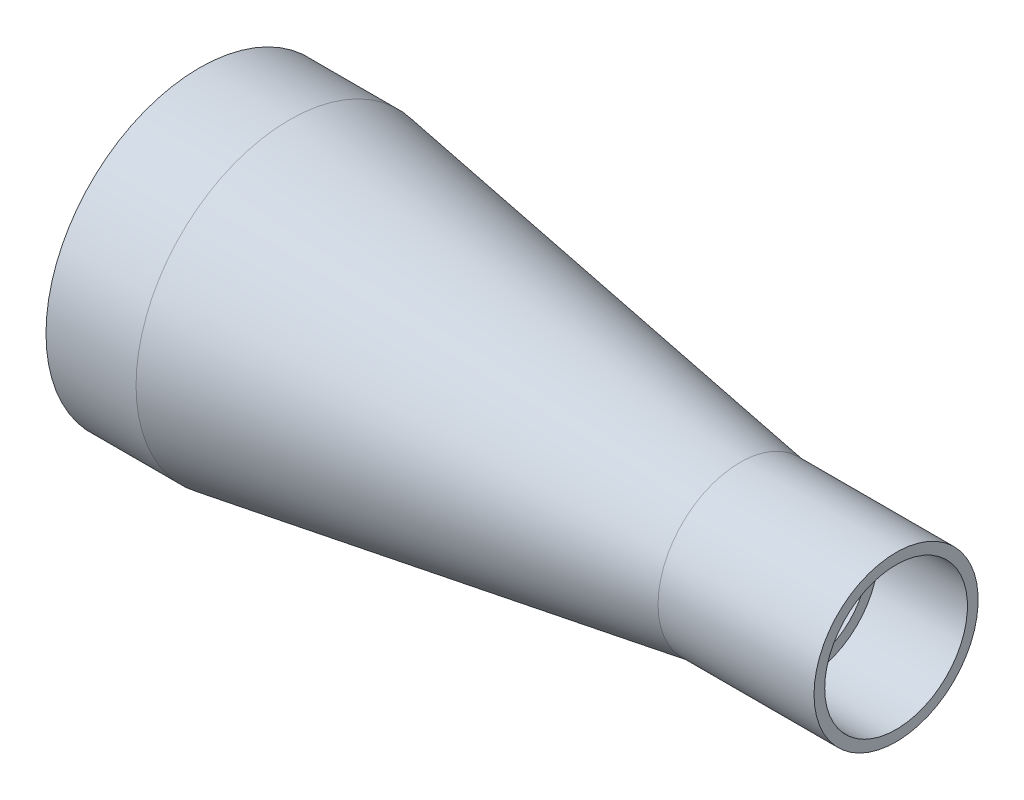
ISO-10303-21;
HEADER;
FILE_DESCRIPTION(('STEP AP214'),'2;1');
FILE_NAME('part.step','',(''),(''),'','','');
FILE_SCHEMA(('AUTOMOTIVE_DESIGN { 1 0 10303 214 1 1 1 1 }'));
ENDSEC;
DATA;
#1=APPLICATION_CONTEXT('core data for automotive mechanical design processes');
#2=APPLICATION_PROTOCOL_DEFINITION('international standard','automotive_design',2000,#1);
#3=PRODUCT_CONTEXT('',#1,'mechanical');
#4=PRODUCT('Part','Part','',(#3));
#5=PRODUCT_RELATED_PRODUCT_CATEGORY('part','',(#4));
#6=PRODUCT_DEFINITION_FORMATION('','',#4);
#7=PRODUCT_DEFINITION_CONTEXT('part definition',#1,'design');
#8=PRODUCT_DEFINITION('design','',#6,#7);
#9=PRODUCT_DEFINITION_SHAPE('','',#8);
#10=(LENGTH_UNIT() NAMED_UNIT(*) SI_UNIT(.MILLI.,.METRE.));
#11=(NAMED_UNIT(*) PLANE_ANGLE_UNIT() SI_UNIT($,.RADIAN.));
#12=(NAMED_UNIT(*) SI_UNIT($,.STERADIAN.) SOLID_ANGLE_UNIT());
#13=UNCERTAINTY_MEASURE_WITH_UNIT(LENGTH_MEASURE(1.E-05),#10,'distance_accuracy_value','');
#14=(GEOMETRIC_REPRESENTATION_CONTEXT(3) GLOBAL_UNCERTAINTY_ASSIGNED_CONTEXT((#13)) GLOBAL_UNIT_ASSIGNED_CONTEXT((#10,
#11,#12)) REPRESENTATION_CONTEXT('',''));
#15=CARTESIAN_POINT('',(0.,0.,0.));
#16=DIRECTION('',(0.,0.,1.));
#17=DIRECTION('',(1.,0.,0.));
#18=AXIS2_PLACEMENT_3D('',#15,#16,#17);
#19=CARTESIAN_POINT('',(0.,0.,-14.8));
#20=DIRECTION('',(1.,0.,0.));
#21=DIRECTION('',(0.,0.,-1.));
#22=AXIS2_PLACEMENT_3D('',#19,#20,#21);
#23=PLANE('',#22);
#24=CARTESIAN_POINT('',(0.,0.,0.));
#25=DIRECTION('',(-1.,0.,0.));
#26=DIRECTION('',(0.,0.,1.));
#27=AXIS2_PLACEMENT_3D('',#24,#25,#26);
#28=CIRCLE('',#27,14.8);
#29=CARTESIAN_POINT('',(0.,0.,14.8));
#30=VERTEX_POINT('',#29);
#31=EDGE_CURVE('E12',#30,#30,#28,.T.);
#32=ORIENTED_EDGE('',*,*,#31,.F.);
#33=EDGE_LOOP('',(#32));
#34=FACE_BOUND('',#33,.T.);
#35=CARTESIAN_POINT('',(0.,0.,0.));
#36=DIRECTION('',(-1.,0.,0.));
#37=DIRECTION('',(0.,0.,1.));
#38=AXIS2_PLACEMENT_3D('',#35,#36,#37);
#39=CIRCLE('',#38,16.);
#40=CARTESIAN_POINT('',(0.,0.,16.));
#41=VERTEX_POINT('',#40);
#42=EDGE_CURVE('E79',#41,#41,#39,.T.);
#43=ORIENTED_EDGE('',*,*,#42,.T.);
#44=EDGE_LOOP('',(#43));
#45=FACE_BOUND('',#44,.T.);
#46=ADVANCED_FACE('F42',(#34,#45),#23,.F.);
#47=CARTESIAN_POINT('',(-12.4462365591398,0.,0.));
#48=DIRECTION('',(-1.,0.,0.));
#49=DIRECTION('',(0.,0.,1.));
#50=AXIS2_PLACEMENT_3D('',#47,#48,#49);
#51=CYLINDRICAL_SURFACE('',#50,14.8);
#52=CARTESIAN_POINT('',(7.57650181761039,0.,0.));
#53=DIRECTION('',(-1.,0.,0.));
#54=DIRECTION('',(0.,0.,1.));
#55=AXIS2_PLACEMENT_3D('',#52,#53,#54);
#56=CIRCLE('',#55,14.8);
#57=CARTESIAN_POINT('',(7.57650181761039,0.,14.8));
#58=VERTEX_POINT('',#57);
#59=EDGE_CURVE('E48',#58,#58,#56,.T.);
#60=ORIENTED_EDGE('',*,*,#59,.F.);
#61=EDGE_LOOP('',(#60));
#62=FACE_BOUND('',#61,.T.);
#63=ORIENTED_EDGE('',*,*,#31,.T.);
#64=EDGE_LOOP('',(#63));
#65=FACE_BOUND('',#64,.T.);
#66=ADVANCED_FACE('F134',(#62,#65),#51,.F.);
#67=CARTESIAN_POINT('',(50.5100121174026,0.,0.));
#68=DIRECTION('',(-1.,0.,0.));
#69=DIRECTION('',(0.,0.,1.));
#70=AXIS2_PLACEMENT_3D('',#67,#68,#69);
#71=CONICAL_SURFACE('',#70,8.,0.157079632679483);
#72=CARTESIAN_POINT('',(58.086513935013,0.,0.));
#73=DIRECTION('',(-1.,0.,0.));
#74=DIRECTION('',(0.,0.,1.));
#75=AXIS2_PLACEMENT_3D('',#72,#73,#74);
#76=CIRCLE('',#75,6.8);
#77=CARTESIAN_POINT('',(58.086513935013,0.,6.8));
#78=VERTEX_POINT('',#77);
#79=EDGE_CURVE('E52',#78,#78,#76,.T.);
#80=ORIENTED_EDGE('',*,*,#79,.F.);
#81=EDGE_LOOP('',(#80));
#82=FACE_BOUND('',#81,.T.);
#83=ORIENTED_EDGE('',*,*,#59,.T.);
#84=EDGE_LOOP('',(#83));
#85=FACE_BOUND('',#84,.T.);
#86=ADVANCED_FACE('F129',(#82,#85),#71,.F.);
#87=CARTESIAN_POINT('',(58.086513935013,0.,-6.8));
#88=DIRECTION('',(-1.,0.,0.));
#89=DIRECTION('',(0.,0.,1.));
#90=AXIS2_PLACEMENT_3D('',#87,#88,#89);
#91=PLANE('',#90);
#92=CARTESIAN_POINT('',(58.086513935013,0.,0.));
#93=DIRECTION('',(-1.,0.,0.));
#94=DIRECTION('',(0.,0.,1.));
#95=AXIS2_PLACEMENT_3D('',#92,#93,#94);
#96=CIRCLE('',#95,8.);
#97=CARTESIAN_POINT('',(58.086513935013,0.,8.));
#98=VERTEX_POINT('',#97);
#99=EDGE_CURVE('E56',#98,#98,#96,.T.);
#100=ORIENTED_EDGE('',*,*,#99,.F.);
#101=EDGE_LOOP('',(#100));
#102=FACE_BOUND('',#101,.T.);
#103=ORIENTED_EDGE('',*,*,#79,.T.);
#104=EDGE_LOOP('',(#103));
#105=FACE_BOUND('',#104,.T.);
#106=ADVANCED_FACE('F123',(#102,#105),#91,.F.);
#107=CARTESIAN_POINT('',(-12.4462365591398,0.,0.));
#108=DIRECTION('',(-1.,0.,0.));
#109=DIRECTION('',(0.,0.,1.));
#110=AXIS2_PLACEMENT_3D('',#107,#108,#109);
#111=CYLINDRICAL_SURFACE('',#110,8.);
#112=CARTESIAN_POINT('',(68.086513935013,0.,0.));
#113=DIRECTION('',(-1.,0.,0.));
#114=DIRECTION('',(0.,0.,1.));
#115=AXIS2_PLACEMENT_3D('',#112,#113,#114);
#116=CIRCLE('',#115,8.);
#117=CARTESIAN_POINT('',(68.086513935013,0.,8.));
#118=VERTEX_POINT('',#117);
#119=EDGE_CURVE('E61',#118,#118,#116,.T.);
#120=ORIENTED_EDGE('',*,*,#119,.F.);
#121=EDGE_LOOP('',(#120));
#122=FACE_BOUND('',#121,.T.);
#123=ORIENTED_EDGE('',*,*,#99,.T.);
#124=EDGE_LOOP('',(#123));
#125=FACE_BOUND('',#124,.T.);
#126=ADVANCED_FACE('F117',(#122,#125),#111,.F.);
#127=CARTESIAN_POINT('',(68.086513935013,0.,-8.));
#128=DIRECTION('',(-1.,0.,0.));
#129=DIRECTION('',(0.,0.,1.));
#130=AXIS2_PLACEMENT_3D('',#127,#128,#129);
#131=PLANE('',#130);
#132=CARTESIAN_POINT('',(68.086513935013,0.,0.));
#133=DIRECTION('',(-1.,0.,0.));
#134=DIRECTION('',(0.,0.,1.));
#135=AXIS2_PLACEMENT_3D('',#132,#133,#134);
#136=CIRCLE('',#135,9.2);
#137=CARTESIAN_POINT('',(68.086513935013,0.,9.2));
#138=VERTEX_POINT('',#137);
#139=EDGE_CURVE('E64',#138,#138,#136,.T.);
#140=ORIENTED_EDGE('',*,*,#139,.F.);
#141=EDGE_LOOP('',(#140));
#142=FACE_BOUND('',#141,.T.);
#143=ORIENTED_EDGE('',*,*,#119,.T.);
#144=EDGE_LOOP('',(#143));
#145=FACE_BOUND('',#144,.T.);
#146=ADVANCED_FACE('F111',(#142,#145),#131,.F.);
#147=CARTESIAN_POINT('',(-12.4462365591398,0.,0.));
#148=DIRECTION('',(-1.,0.,0.));
#149=DIRECTION('',(0.,0.,1.));
#150=AXIS2_PLACEMENT_3D('',#147,#148,#149);
#151=CYLINDRICAL_SURFACE('',#150,9.2);
#152=CARTESIAN_POINT('',(50.6044541655921,0.,0.));
#153=DIRECTION('',(-1.,0.,0.));
#154=DIRECTION('',(0.,0.,1.));
#155=AXIS2_PLACEMENT_3D('',#152,#153,#154);
#156=CIRCLE('',#155,9.2);
#157=CARTESIAN_POINT('',(50.6044541655921,0.,9.2));
#158=VERTEX_POINT('',#157);
#159=EDGE_CURVE('E67',#158,#158,#156,.T.);
#160=ORIENTED_EDGE('',*,*,#159,.F.);
#161=EDGE_LOOP('',(#160));
#162=FACE_BOUND('',#161,.T.);
#163=ORIENTED_EDGE('',*,*,#139,.T.);
#164=EDGE_LOOP('',(#163));
#165=FACE_BOUND('',#164,.T.);
#166=ADVANCED_FACE('F105',(#162,#165),#151,.T.);
#167=CARTESIAN_POINT('',(50.6044541655921,0.,0.));
#168=DIRECTION('',(-1.,0.,0.));
#169=DIRECTION('',(0.,0.,1.));
#170=AXIS2_PLACEMENT_3D('',#167,#168,#169);
#171=CONICAL_SURFACE('',#170,9.2,0.157079632679483);
#172=CARTESIAN_POINT('',(0.0944420481895289,0.,0.));
#173=DIRECTION('',(-1.,0.,0.));
#174=DIRECTION('',(0.,0.,1.));
#175=AXIS2_PLACEMENT_3D('',#172,#173,#174);
#176=CIRCLE('',#175,17.2);
#177=CARTESIAN_POINT('',(0.0944420481895289,0.,17.2));
#178=VERTEX_POINT('',#177);
#179=EDGE_CURVE('E70',#178,#178,#176,.T.);
#180=ORIENTED_EDGE('',*,*,#179,.F.);
#181=EDGE_LOOP('',(#180));
#182=FACE_BOUND('',#181,.T.);
#183=ORIENTED_EDGE('',*,*,#159,.T.);
#184=EDGE_LOOP('',(#183));
#185=FACE_BOUND('',#184,.T.);
#186=ADVANCED_FACE('F99',(#182,#185),#171,.T.);
#187=CARTESIAN_POINT('',(-12.4462365591398,0.,0.));
#188=DIRECTION('',(-1.,0.,0.));
#189=DIRECTION('',(0.,0.,1.));
#190=AXIS2_PLACEMENT_3D('',#187,#188,#189);
#191=CYLINDRICAL_SURFACE('',#190,17.2);
#192=CARTESIAN_POINT('',(-10.,0.,0.));
#193=DIRECTION('',(-1.,0.,0.));
#194=DIRECTION('',(0.,0.,1.));
#195=AXIS2_PLACEMENT_3D('',#192,#193,#194);
#196=CIRCLE('',#195,17.2);
#197=CARTESIAN_POINT('',(-10.,0.,17.2));
#198=VERTEX_POINT('',#197);
#199=EDGE_CURVE('E73',#198,#198,#196,.T.);
#200=ORIENTED_EDGE('',*,*,#199,.F.);
#201=EDGE_LOOP('',(#200));
#202=FACE_BOUND('',#201,.T.);
#203=ORIENTED_EDGE('',*,*,#179,.T.);
#204=EDGE_LOOP('',(#203));
#205=FACE_BOUND('',#204,.T.);
#206=ADVANCED_FACE('F93',(#202,#205),#191,.T.);
#207=CARTESIAN_POINT('',(-10.,0.,-16.));
#208=DIRECTION('',(1.,0.,0.));
#209=DIRECTION('',(0.,0.,-1.));
#210=AXIS2_PLACEMENT_3D('',#207,#208,#209);
#211=PLANE('',#210);
#212=CARTESIAN_POINT('',(-10.,0.,0.));
#213=DIRECTION('',(-1.,0.,0.));
#214=DIRECTION('',(0.,0.,1.));
#215=AXIS2_PLACEMENT_3D('',#212,#213,#214);
#216=CIRCLE('',#215,16.);
#217=CARTESIAN_POINT('',(-10.,0.,16.));
#218=VERTEX_POINT('',#217);
#219=EDGE_CURVE('E76',#218,#218,#216,.T.);
#220=ORIENTED_EDGE('',*,*,#219,.F.);
#221=EDGE_LOOP('',(#220));
#222=FACE_BOUND('',#221,.T.);
#223=ORIENTED_EDGE('',*,*,#199,.T.);
#224=EDGE_LOOP('',(#223));
#225=FACE_BOUND('',#224,.T.);
#226=ADVANCED_FACE('F87',(#222,#225),#211,.F.);
#227=CARTESIAN_POINT('',(-12.4462365591398,0.,0.));
#228=DIRECTION('',(-1.,0.,0.));
#229=DIRECTION('',(0.,0.,1.));
#230=AXIS2_PLACEMENT_3D('',#227,#228,#229);
#231=CYLINDRICAL_SURFACE('',#230,16.);
#232=ORIENTED_EDGE('',*,*,#42,.F.);
#233=EDGE_LOOP('',(#232));
#234=FACE_BOUND('',#233,.T.);
#235=ORIENTED_EDGE('',*,*,#219,.T.);
#236=EDGE_LOOP('',(#235));
#237=FACE_BOUND('',#236,.T.);
#238=ADVANCED_FACE('F84',(#234,#237),#231,.F.);
#239=CLOSED_SHELL('',(#46,#66,#86,#106,#126,#146,#166,#186,#206,#226,#238));
#240=MANIFOLD_SOLID_BREP('B2',#239);
#241=ADVANCED_BREP_SHAPE_REPRESENTATION('',(#18,#240),#14);
#242=SHAPE_DEFINITION_REPRESENTATION(#9,#241);
ENDSEC;
END-ISO-10303-21;
